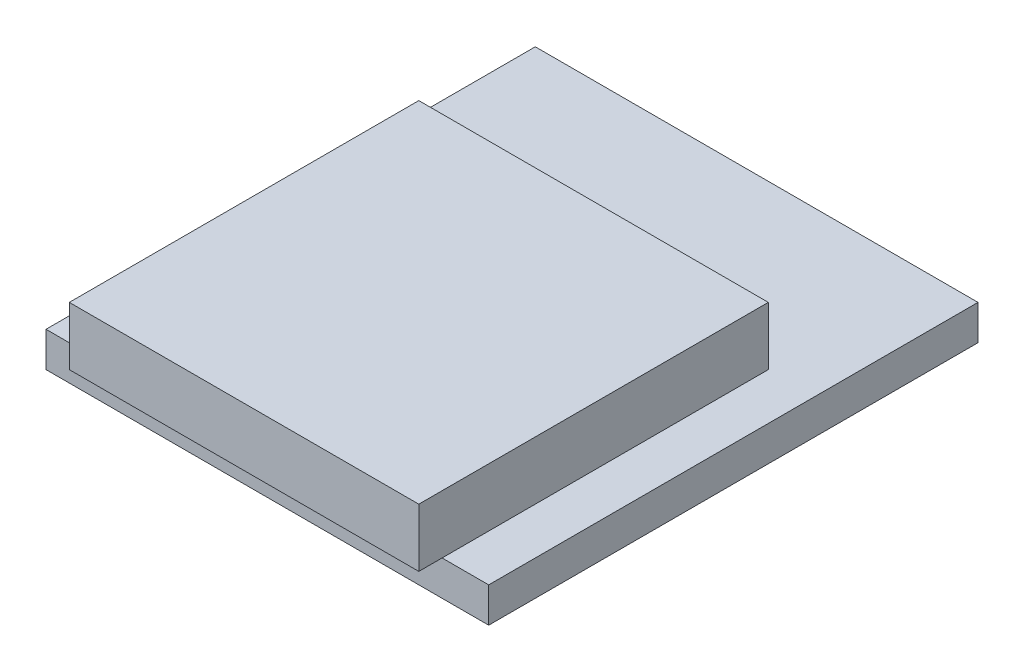
ISO-10303-21;
HEADER;
FILE_DESCRIPTION(('STEP AP214'),'2;1');
FILE_NAME('part.step','',(''),(''),'','','');
FILE_SCHEMA(('AUTOMOTIVE_DESIGN { 1 0 10303 214 1 1 1 1 }'));
ENDSEC;
DATA;
#1=APPLICATION_CONTEXT('core data for automotive mechanical design processes');
#2=APPLICATION_PROTOCOL_DEFINITION('international standard','automotive_design',2000,#1);
#3=PRODUCT_CONTEXT('',#1,'mechanical');
#4=PRODUCT('Part','Part','',(#3));
#5=PRODUCT_RELATED_PRODUCT_CATEGORY('part','',(#4));
#6=PRODUCT_DEFINITION_FORMATION('','',#4);
#7=PRODUCT_DEFINITION_CONTEXT('part definition',#1,'design');
#8=PRODUCT_DEFINITION('design','',#6,#7);
#9=PRODUCT_DEFINITION_SHAPE('','',#8);
#10=(LENGTH_UNIT() NAMED_UNIT(*) SI_UNIT(.MILLI.,.METRE.));
#11=(NAMED_UNIT(*) PLANE_ANGLE_UNIT() SI_UNIT($,.RADIAN.));
#12=(NAMED_UNIT(*) SI_UNIT($,.STERADIAN.) SOLID_ANGLE_UNIT());
#13=UNCERTAINTY_MEASURE_WITH_UNIT(LENGTH_MEASURE(1.E-05),#10,'distance_accuracy_value','');
#14=(GEOMETRIC_REPRESENTATION_CONTEXT(3) GLOBAL_UNCERTAINTY_ASSIGNED_CONTEXT((#13)) GLOBAL_UNIT_ASSIGNED_CONTEXT((#10,
#11,#12)) REPRESENTATION_CONTEXT('',''));
#15=CARTESIAN_POINT('',(0.,0.,0.));
#16=DIRECTION('',(0.,0.,1.));
#17=DIRECTION('',(1.,0.,0.));
#18=AXIS2_PLACEMENT_3D('',#15,#16,#17);
#19=CARTESIAN_POINT('',(0.,0.,0.));
#20=DIRECTION('',(0.,1.,0.));
#21=DIRECTION('',(0.,0.,1.));
#22=AXIS2_PLACEMENT_3D('',#19,#20,#21);
#23=PLANE('',#22);
#24=DIRECTION('',(-1.,0.,0.));
#25=VECTOR('',#24,1.);
#26=CARTESIAN_POINT('',(9.5,0.,6.5));
#27=LINE('',#26,#25);
#28=CARTESIAN_POINT('',(7.5,0.,6.5));
#29=VERTEX_POINT('',#28);
#30=CARTESIAN_POINT('',(-7.5,0.,6.5));
#31=VERTEX_POINT('',#30);
#32=EDGE_CURVE('E11',#29,#31,#27,.T.);
#33=ORIENTED_EDGE('',*,*,#32,.F.);
#34=DIRECTION('',(0.,0.,-1.));
#35=VECTOR('',#34,1.);
#36=CARTESIAN_POINT('',(7.5,0.,-7.5));
#37=LINE('',#36,#35);
#38=CARTESIAN_POINT('',(7.5,0.,7.5));
#39=VERTEX_POINT('',#38);
#40=EDGE_CURVE('E145',#39,#29,#37,.T.);
#41=ORIENTED_EDGE('',*,*,#40,.F.);
#42=DIRECTION('',(1.,0.,0.));
#43=VECTOR('',#42,1.);
#44=CARTESIAN_POINT('',(-7.5,0.,7.5));
#45=LINE('',#44,#43);
#46=CARTESIAN_POINT('',(-7.5,0.,7.5));
#47=VERTEX_POINT('',#46);
#48=EDGE_CURVE('E79',#47,#39,#45,.T.);
#49=ORIENTED_EDGE('',*,*,#48,.F.);
#50=DIRECTION('',(0.,0.,1.));
#51=VECTOR('',#50,1.);
#52=CARTESIAN_POINT('',(-7.5,0.,-7.5));
#53=LINE('',#52,#51);
#54=EDGE_CURVE('E160',#31,#47,#53,.T.);
#55=ORIENTED_EDGE('',*,*,#54,.F.);
#56=EDGE_LOOP('',(#33,#41,#49,#55));
#57=FACE_BOUND('',#56,.T.);
#58=ADVANCED_FACE('F33',(#57),#23,.F.);
#59=CARTESIAN_POINT('',(7.5,2.5,-7.5));
#60=DIRECTION('',(-1.,0.,0.));
#61=DIRECTION('',(0.,0.,1.));
#62=AXIS2_PLACEMENT_3D('',#59,#60,#61);
#63=PLANE('',#62);
#64=ORIENTED_EDGE('',*,*,#40,.T.);
#65=CARTESIAN_POINT('',(7.5,0.,-7.5));
#66=VERTEX_POINT('',#65);
#67=EDGE_CURVE('E143',#29,#66,#37,.T.);
#68=ORIENTED_EDGE('',*,*,#67,.T.);
#69=DIRECTION('',(0.,-1.,0.));
#70=VECTOR('',#69,1.);
#71=CARTESIAN_POINT('',(7.5,2.5,-7.5));
#72=LINE('',#71,#70);
#73=CARTESIAN_POINT('',(7.5,2.5,-7.5));
#74=VERTEX_POINT('',#73);
#75=EDGE_CURVE('E37',#74,#66,#72,.T.);
#76=ORIENTED_EDGE('',*,*,#75,.F.);
#77=DIRECTION('',(0.,0.,-1.));
#78=VECTOR('',#77,1.);
#79=CARTESIAN_POINT('',(7.5,2.5,-7.5));
#80=LINE('',#79,#78);
#81=CARTESIAN_POINT('',(7.5,2.5,7.5));
#82=VERTEX_POINT('',#81);
#83=EDGE_CURVE('E151',#82,#74,#80,.T.);
#84=ORIENTED_EDGE('',*,*,#83,.F.);
#85=DIRECTION('',(0.,-1.,0.));
#86=VECTOR('',#85,1.);
#87=CARTESIAN_POINT('',(7.5,2.5,7.5));
#88=LINE('',#87,#86);
#89=EDGE_CURVE('E156',#82,#39,#88,.T.);
#90=ORIENTED_EDGE('',*,*,#89,.T.);
#91=EDGE_LOOP('',(#64,#68,#76,#84,#90));
#92=FACE_BOUND('',#91,.T.);
#93=ADVANCED_FACE('F35',(#92),#63,.F.);
#94=CARTESIAN_POINT('',(-7.5,2.5,-7.5));
#95=DIRECTION('',(0.,0.,1.));
#96=DIRECTION('',(1.,0.,0.));
#97=AXIS2_PLACEMENT_3D('',#94,#95,#96);
#98=PLANE('',#97);
#99=DIRECTION('',(-1.,0.,0.));
#100=VECTOR('',#99,1.);
#101=CARTESIAN_POINT('',(-7.5,0.,-7.5));
#102=LINE('',#101,#100);
#103=CARTESIAN_POINT('',(-7.5,0.,-7.5));
#104=VERTEX_POINT('',#103);
#105=EDGE_CURVE('E158',#66,#104,#102,.T.);
#106=ORIENTED_EDGE('',*,*,#105,.T.);
#107=DIRECTION('',(0.,-1.,0.));
#108=VECTOR('',#107,1.);
#109=CARTESIAN_POINT('',(-7.5,2.5,-7.5));
#110=LINE('',#109,#108);
#111=CARTESIAN_POINT('',(-7.5,2.5,-7.5));
#112=VERTEX_POINT('',#111);
#113=EDGE_CURVE('E166',#112,#104,#110,.T.);
#114=ORIENTED_EDGE('',*,*,#113,.F.);
#115=DIRECTION('',(-1.,0.,0.));
#116=VECTOR('',#115,1.);
#117=CARTESIAN_POINT('',(-7.5,2.5,-7.5));
#118=LINE('',#117,#116);
#119=EDGE_CURVE('E87',#74,#112,#118,.T.);
#120=ORIENTED_EDGE('',*,*,#119,.F.);
#121=ORIENTED_EDGE('',*,*,#75,.T.);
#122=EDGE_LOOP('',(#106,#114,#120,#121));
#123=FACE_BOUND('',#122,.T.);
#124=ADVANCED_FACE('F173',(#123),#98,.F.);
#125=CARTESIAN_POINT('',(-7.5,2.5,-7.5));
#126=DIRECTION('',(1.,0.,0.));
#127=DIRECTION('',(0.,0.,-1.));
#128=AXIS2_PLACEMENT_3D('',#125,#126,#127);
#129=PLANE('',#128);
#130=EDGE_CURVE('E161',#104,#31,#53,.T.);
#131=ORIENTED_EDGE('',*,*,#130,.T.);
#132=ORIENTED_EDGE('',*,*,#54,.T.);
#133=DIRECTION('',(0.,-1.,0.));
#134=VECTOR('',#133,1.);
#135=CARTESIAN_POINT('',(-7.5,2.5,7.5));
#136=LINE('',#135,#134);
#137=CARTESIAN_POINT('',(-7.5,2.5,7.5));
#138=VERTEX_POINT('',#137);
#139=EDGE_CURVE('E165',#138,#47,#136,.T.);
#140=ORIENTED_EDGE('',*,*,#139,.F.);
#141=DIRECTION('',(0.,0.,1.));
#142=VECTOR('',#141,1.);
#143=CARTESIAN_POINT('',(-7.5,2.5,-7.5));
#144=LINE('',#143,#142);
#145=EDGE_CURVE('E154',#112,#138,#144,.T.);
#146=ORIENTED_EDGE('',*,*,#145,.F.);
#147=ORIENTED_EDGE('',*,*,#113,.T.);
#148=EDGE_LOOP('',(#131,#132,#140,#146,#147));
#149=FACE_BOUND('',#148,.T.);
#150=ADVANCED_FACE('F181',(#149),#129,.F.);
#151=CARTESIAN_POINT('',(-7.5,2.5,7.5));
#152=DIRECTION('',(0.,0.,-1.));
#153=DIRECTION('',(-1.,0.,0.));
#154=AXIS2_PLACEMENT_3D('',#151,#152,#153);
#155=PLANE('',#154);
#156=ORIENTED_EDGE('',*,*,#48,.T.);
#157=ORIENTED_EDGE('',*,*,#89,.F.);
#158=DIRECTION('',(1.,0.,0.));
#159=VECTOR('',#158,1.);
#160=CARTESIAN_POINT('',(-7.5,2.5,7.5));
#161=LINE('',#160,#159);
#162=EDGE_CURVE('E58',#138,#82,#161,.T.);
#163=ORIENTED_EDGE('',*,*,#162,.F.);
#164=ORIENTED_EDGE('',*,*,#139,.T.);
#165=EDGE_LOOP('',(#156,#157,#163,#164));
#166=FACE_BOUND('',#165,.T.);
#167=ADVANCED_FACE('F183',(#166),#155,.F.);
#168=CARTESIAN_POINT('',(0.,2.5,0.));
#169=DIRECTION('',(0.,1.,0.));
#170=DIRECTION('',(0.,0.,1.));
#171=AXIS2_PLACEMENT_3D('',#168,#169,#170);
#172=PLANE('',#171);
#173=ORIENTED_EDGE('',*,*,#83,.T.);
#174=ORIENTED_EDGE('',*,*,#119,.T.);
#175=ORIENTED_EDGE('',*,*,#145,.T.);
#176=ORIENTED_EDGE('',*,*,#162,.T.);
#177=EDGE_LOOP('',(#173,#174,#175,#176));
#178=FACE_BOUND('',#177,.T.);
#179=ADVANCED_FACE('F184',(#178),#172,.T.);
#180=CARTESIAN_POINT('',(0.,0.,0.));
#181=DIRECTION('',(0.,1.,0.));
#182=DIRECTION('',(0.,0.,1.));
#183=AXIS2_PLACEMENT_3D('',#180,#181,#182);
#184=PLANE('',#183);
#185=ORIENTED_EDGE('',*,*,#67,.F.);
#186=CARTESIAN_POINT('',(9.5,0.,6.5));
#187=VERTEX_POINT('',#186);
#188=EDGE_CURVE('E43',#187,#29,#27,.T.);
#189=ORIENTED_EDGE('',*,*,#188,.F.);
#190=DIRECTION('',(0.,0.,1.));
#191=VECTOR('',#190,1.);
#192=CARTESIAN_POINT('',(9.5,0.,6.5));
#193=LINE('',#192,#191);
#194=CARTESIAN_POINT('',(9.5,0.,-14.5));
#195=VERTEX_POINT('',#194);
#196=EDGE_CURVE('E142',#195,#187,#193,.T.);
#197=ORIENTED_EDGE('',*,*,#196,.F.);
#198=DIRECTION('',(1.,0.,0.));
#199=VECTOR('',#198,1.);
#200=CARTESIAN_POINT('',(9.5,0.,-14.5));
#201=LINE('',#200,#199);
#202=CARTESIAN_POINT('',(-9.5,0.,-14.5));
#203=VERTEX_POINT('',#202);
#204=EDGE_CURVE('E138',#203,#195,#201,.T.);
#205=ORIENTED_EDGE('',*,*,#204,.F.);
#206=DIRECTION('',(0.,0.,-1.));
#207=VECTOR('',#206,1.);
#208=CARTESIAN_POINT('',(-9.5,0.,6.5));
#209=LINE('',#208,#207);
#210=CARTESIAN_POINT('',(-9.5,0.,6.5));
#211=VERTEX_POINT('',#210);
#212=EDGE_CURVE('E287',#211,#203,#209,.T.);
#213=ORIENTED_EDGE('',*,*,#212,.F.);
#214=EDGE_CURVE('E44',#31,#211,#27,.T.);
#215=ORIENTED_EDGE('',*,*,#214,.F.);
#216=ORIENTED_EDGE('',*,*,#130,.F.);
#217=ORIENTED_EDGE('',*,*,#105,.F.);
#218=EDGE_LOOP('',(#185,#189,#197,#205,#213,#215,#216,#217));
#219=FACE_BOUND('',#218,.T.);
#220=ADVANCED_FACE('F178',(#219),#184,.T.);
#221=CARTESIAN_POINT('',(9.5,-1.5,6.5));
#222=DIRECTION('',(-1.,0.,0.));
#223=DIRECTION('',(0.,0.,1.));
#224=AXIS2_PLACEMENT_3D('',#221,#222,#223);
#225=PLANE('',#224);
#226=ORIENTED_EDGE('',*,*,#196,.T.);
#227=DIRECTION('',(0.,1.,0.));
#228=VECTOR('',#227,1.);
#229=CARTESIAN_POINT('',(9.5,-1.5,6.5));
#230=LINE('',#229,#228);
#231=CARTESIAN_POINT('',(9.5,-1.5,6.5));
#232=VERTEX_POINT('',#231);
#233=EDGE_CURVE('E122',#232,#187,#230,.T.);
#234=ORIENTED_EDGE('',*,*,#233,.F.);
#235=DIRECTION('',(0.,0.,1.));
#236=VECTOR('',#235,1.);
#237=CARTESIAN_POINT('',(9.5,-1.5,6.5));
#238=LINE('',#237,#236);
#239=CARTESIAN_POINT('',(9.5,-1.5,-14.5));
#240=VERTEX_POINT('',#239);
#241=EDGE_CURVE('E129',#240,#232,#238,.T.);
#242=ORIENTED_EDGE('',*,*,#241,.F.);
#243=DIRECTION('',(0.,1.,0.));
#244=VECTOR('',#243,1.);
#245=CARTESIAN_POINT('',(9.5,-1.5,-14.5));
#246=LINE('',#245,#244);
#247=EDGE_CURVE('E285',#240,#195,#246,.T.);
#248=ORIENTED_EDGE('',*,*,#247,.T.);
#249=EDGE_LOOP('',(#226,#234,#242,#248));
#250=FACE_BOUND('',#249,.T.);
#251=ADVANCED_FACE('F140',(#250),#225,.F.);
#252=CARTESIAN_POINT('',(9.5,-1.5,6.5));
#253=DIRECTION('',(0.,0.,-1.));
#254=DIRECTION('',(-1.,0.,0.));
#255=AXIS2_PLACEMENT_3D('',#252,#253,#254);
#256=PLANE('',#255);
#257=ORIENTED_EDGE('',*,*,#188,.T.);
#258=ORIENTED_EDGE('',*,*,#32,.T.);
#259=ORIENTED_EDGE('',*,*,#214,.T.);
#260=DIRECTION('',(0.,1.,0.));
#261=VECTOR('',#260,1.);
#262=CARTESIAN_POINT('',(-9.5,-1.5,6.5));
#263=LINE('',#262,#261);
#264=CARTESIAN_POINT('',(-9.5,-1.5,6.5));
#265=VERTEX_POINT('',#264);
#266=EDGE_CURVE('E125',#265,#211,#263,.T.);
#267=ORIENTED_EDGE('',*,*,#266,.F.);
#268=DIRECTION('',(-1.,0.,0.));
#269=VECTOR('',#268,1.);
#270=CARTESIAN_POINT('',(9.5,-1.5,6.5));
#271=LINE('',#270,#269);
#272=EDGE_CURVE('E117',#232,#265,#271,.T.);
#273=ORIENTED_EDGE('',*,*,#272,.F.);
#274=ORIENTED_EDGE('',*,*,#233,.T.);
#275=EDGE_LOOP('',(#257,#258,#259,#267,#273,#274));
#276=FACE_BOUND('',#275,.T.);
#277=ADVANCED_FACE('F120',(#276),#256,.F.);
#278=CARTESIAN_POINT('',(-9.5,-1.5,6.5));
#279=DIRECTION('',(1.,0.,0.));
#280=DIRECTION('',(0.,0.,-1.));
#281=AXIS2_PLACEMENT_3D('',#278,#279,#280);
#282=PLANE('',#281);
#283=ORIENTED_EDGE('',*,*,#212,.T.);
#284=DIRECTION('',(0.,1.,0.));
#285=VECTOR('',#284,1.);
#286=CARTESIAN_POINT('',(-9.5,-1.5,-14.5));
#287=LINE('',#286,#285);
#288=CARTESIAN_POINT('',(-9.5,-1.5,-14.5));
#289=VERTEX_POINT('',#288);
#290=EDGE_CURVE('E147',#289,#203,#287,.T.);
#291=ORIENTED_EDGE('',*,*,#290,.F.);
#292=DIRECTION('',(0.,0.,-1.));
#293=VECTOR('',#292,1.);
#294=CARTESIAN_POINT('',(-9.5,-1.5,6.5));
#295=LINE('',#294,#293);
#296=EDGE_CURVE('E128',#265,#289,#295,.T.);
#297=ORIENTED_EDGE('',*,*,#296,.F.);
#298=ORIENTED_EDGE('',*,*,#266,.T.);
#299=EDGE_LOOP('',(#283,#291,#297,#298));
#300=FACE_BOUND('',#299,.T.);
#301=ADVANCED_FACE('F251',(#300),#282,.F.);
#302=CARTESIAN_POINT('',(9.5,-1.5,-14.5));
#303=DIRECTION('',(0.,0.,1.));
#304=DIRECTION('',(1.,0.,0.));
#305=AXIS2_PLACEMENT_3D('',#302,#303,#304);
#306=PLANE('',#305);
#307=ORIENTED_EDGE('',*,*,#204,.T.);
#308=ORIENTED_EDGE('',*,*,#247,.F.);
#309=DIRECTION('',(1.,0.,0.));
#310=VECTOR('',#309,1.);
#311=CARTESIAN_POINT('',(9.5,-1.5,-14.5));
#312=LINE('',#311,#310);
#313=EDGE_CURVE('E134',#289,#240,#312,.T.);
#314=ORIENTED_EDGE('',*,*,#313,.F.);
#315=ORIENTED_EDGE('',*,*,#290,.T.);
#316=EDGE_LOOP('',(#307,#308,#314,#315));
#317=FACE_BOUND('',#316,.T.);
#318=ADVANCED_FACE('F259',(#317),#306,.F.);
#319=CARTESIAN_POINT('',(0.,-1.5,0.));
#320=DIRECTION('',(0.,1.,0.));
#321=DIRECTION('',(0.,0.,1.));
#322=AXIS2_PLACEMENT_3D('',#319,#320,#321);
#323=PLANE('',#322);
#324=ORIENTED_EDGE('',*,*,#241,.T.);
#325=ORIENTED_EDGE('',*,*,#272,.T.);
#326=ORIENTED_EDGE('',*,*,#296,.T.);
#327=ORIENTED_EDGE('',*,*,#313,.T.);
#328=EDGE_LOOP('',(#324,#325,#326,#327));
#329=FACE_BOUND('',#328,.T.);
#330=ADVANCED_FACE('F132',(#329),#323,.F.);
#331=CLOSED_SHELL('',(#58,#93,#124,#150,#167,#179,#220,#251,#277,#301,#318,#330));
#332=MANIFOLD_SOLID_BREP('B2',#331);
#333=ADVANCED_BREP_SHAPE_REPRESENTATION('',(#18,#332),#14);
#334=SHAPE_DEFINITION_REPRESENTATION(#9,#333);
ENDSEC;
END-ISO-10303-21;
